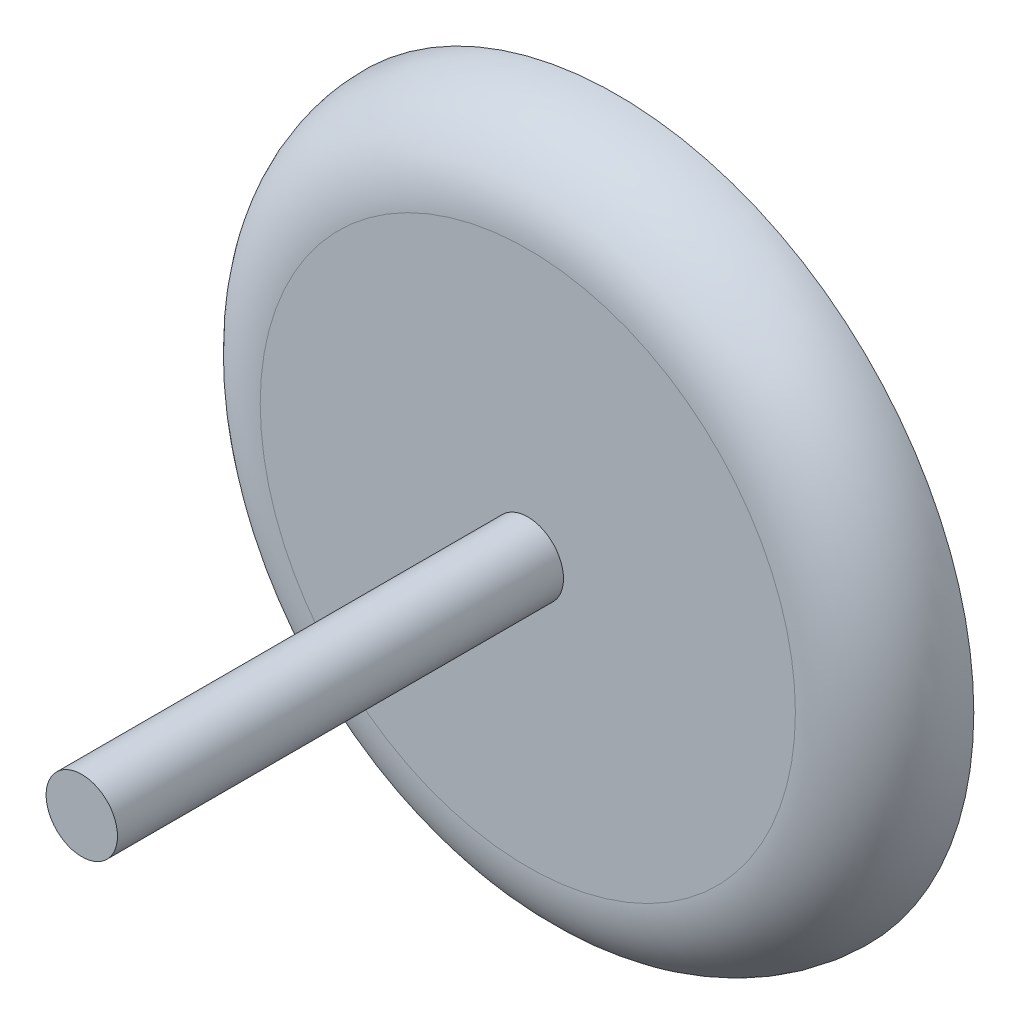
ISO-10303-21;
HEADER;
FILE_DESCRIPTION(('STEP AP214'),'2;1');
FILE_NAME('part.step','',(''),(''),'','','');
FILE_SCHEMA(('AUTOMOTIVE_DESIGN { 1 0 10303 214 1 1 1 1 }'));
ENDSEC;
DATA;
#1=APPLICATION_CONTEXT('core data for automotive mechanical design processes');
#2=APPLICATION_PROTOCOL_DEFINITION('international standard','automotive_design',2000,#1);
#3=PRODUCT_CONTEXT('',#1,'mechanical');
#4=PRODUCT('Part','Part','',(#3));
#5=PRODUCT_RELATED_PRODUCT_CATEGORY('part','',(#4));
#6=PRODUCT_DEFINITION_FORMATION('','',#4);
#7=PRODUCT_DEFINITION_CONTEXT('part definition',#1,'design');
#8=PRODUCT_DEFINITION('design','',#6,#7);
#9=PRODUCT_DEFINITION_SHAPE('','',#8);
#10=(LENGTH_UNIT() NAMED_UNIT(*) SI_UNIT(.MILLI.,.METRE.));
#11=(NAMED_UNIT(*) PLANE_ANGLE_UNIT() SI_UNIT($,.RADIAN.));
#12=(NAMED_UNIT(*) SI_UNIT($,.STERADIAN.) SOLID_ANGLE_UNIT());
#13=UNCERTAINTY_MEASURE_WITH_UNIT(LENGTH_MEASURE(1.E-05),#10,'distance_accuracy_value','');
#14=(GEOMETRIC_REPRESENTATION_CONTEXT(3) GLOBAL_UNCERTAINTY_ASSIGNED_CONTEXT((#13)) GLOBAL_UNIT_ASSIGNED_CONTEXT((#10,
#11,#12)) REPRESENTATION_CONTEXT('',''));
#15=CARTESIAN_POINT('',(0.,0.,0.));
#16=DIRECTION('',(0.,0.,1.));
#17=DIRECTION('',(1.,0.,0.));
#18=AXIS2_PLACEMENT_3D('',#15,#16,#17);
#19=CARTESIAN_POINT('',(0.,0.,10.));
#20=DIRECTION('',(0.,0.,1.));
#21=DIRECTION('',(1.,0.,0.));
#22=AXIS2_PLACEMENT_3D('',#19,#20,#21);
#23=PLANE('',#22);
#24=CARTESIAN_POINT('',(0.,0.,10.));
#25=DIRECTION('',(0.,0.,1.));
#26=DIRECTION('',(1.,0.,0.));
#27=AXIS2_PLACEMENT_3D('',#24,#25,#26);
#28=CIRCLE('',#27,4.);
#29=CARTESIAN_POINT('',(4.,0.,10.));
#30=VERTEX_POINT('',#29);
#31=EDGE_CURVE('E46',#30,#30,#28,.T.);
#32=ORIENTED_EDGE('',*,*,#31,.F.);
#33=EDGE_LOOP('',(#32));
#34=FACE_BOUND('',#33,.T.);
#35=CARTESIAN_POINT('',(0.,0.,10.));
#36=DIRECTION('',(0.,0.,1.));
#37=DIRECTION('',(1.,0.,0.));
#38=AXIS2_PLACEMENT_3D('',#35,#36,#37);
#39=CIRCLE('',#38,30.);
#40=CARTESIAN_POINT('',(30.,0.,10.));
#41=VERTEX_POINT('',#40);
#42=EDGE_CURVE('E10',#41,#41,#39,.T.);
#43=ORIENTED_EDGE('',*,*,#42,.T.);
#44=EDGE_LOOP('',(#43));
#45=FACE_BOUND('',#44,.T.);
#46=ADVANCED_FACE('F31',(#34,#45),#23,.T.);
#47=CARTESIAN_POINT('',(0.,0.,0.));
#48=DIRECTION('',(0.,0.,1.));
#49=DIRECTION('',(1.,0.,0.));
#50=AXIS2_PLACEMENT_3D('',#47,#48,#49);
#51=PLANE('',#50);
#52=CARTESIAN_POINT('',(0.,0.,0.));
#53=DIRECTION('',(0.,0.,1.));
#54=DIRECTION('',(1.,0.,0.));
#55=AXIS2_PLACEMENT_3D('',#52,#53,#54);
#56=CIRCLE('',#55,40.);
#57=CARTESIAN_POINT('',(40.,0.,0.));
#58=VERTEX_POINT('',#57);
#59=EDGE_CURVE('E38',#58,#58,#56,.T.);
#60=ORIENTED_EDGE('',*,*,#59,.F.);
#61=EDGE_LOOP('',(#60));
#62=FACE_BOUND('',#61,.T.);
#63=ADVANCED_FACE('F55',(#62),#51,.F.);
#64=CARTESIAN_POINT('',(0.,0.,0.));
#65=DIRECTION('',(0.,0.,1.));
#66=DIRECTION('',(1.,0.,0.));
#67=AXIS2_PLACEMENT_3D('',#64,#65,#66);
#68=TOROIDAL_SURFACE('',#67,30.,10.);
#69=ORIENTED_EDGE('',*,*,#59,.T.);
#70=EDGE_LOOP('',(#69));
#71=FACE_BOUND('',#70,.T.);
#72=ORIENTED_EDGE('',*,*,#42,.F.);
#73=EDGE_LOOP('',(#72));
#74=FACE_BOUND('',#73,.T.);
#75=ADVANCED_FACE('F33',(#71,#74),#68,.T.);
#76=CARTESIAN_POINT('',(0.,0.,60.));
#77=DIRECTION('',(0.,0.,-1.));
#78=DIRECTION('',(-1.,0.,0.));
#79=AXIS2_PLACEMENT_3D('',#76,#77,#78);
#80=CYLINDRICAL_SURFACE('',#79,4.);
#81=CARTESIAN_POINT('',(0.,0.,60.));
#82=DIRECTION('',(0.,0.,1.));
#83=DIRECTION('',(1.,0.,0.));
#84=AXIS2_PLACEMENT_3D('',#81,#82,#83);
#85=CIRCLE('',#84,4.);
#86=CARTESIAN_POINT('',(4.,0.,60.));
#87=VERTEX_POINT('',#86);
#88=EDGE_CURVE('E42',#87,#87,#85,.T.);
#89=ORIENTED_EDGE('',*,*,#88,.F.);
#90=EDGE_LOOP('',(#89));
#91=FACE_BOUND('',#90,.T.);
#92=ORIENTED_EDGE('',*,*,#31,.T.);
#93=EDGE_LOOP('',(#92));
#94=FACE_BOUND('',#93,.T.);
#95=ADVANCED_FACE('F52',(#91,#94),#80,.T.);
#96=CARTESIAN_POINT('',(0.,0.,60.));
#97=DIRECTION('',(0.,0.,1.));
#98=DIRECTION('',(1.,0.,0.));
#99=AXIS2_PLACEMENT_3D('',#96,#97,#98);
#100=PLANE('',#99);
#101=ORIENTED_EDGE('',*,*,#88,.T.);
#102=EDGE_LOOP('',(#101));
#103=FACE_BOUND('',#102,.T.);
#104=ADVANCED_FACE('F64',(#103),#100,.T.);
#105=CLOSED_SHELL('',(#46,#63,#75,#95,#104));
#106=MANIFOLD_SOLID_BREP('B2',#105);
#107=ADVANCED_BREP_SHAPE_REPRESENTATION('',(#18,#106),#14);
#108=SHAPE_DEFINITION_REPRESENTATION(#9,#107);
ENDSEC;
END-ISO-10303-21;
